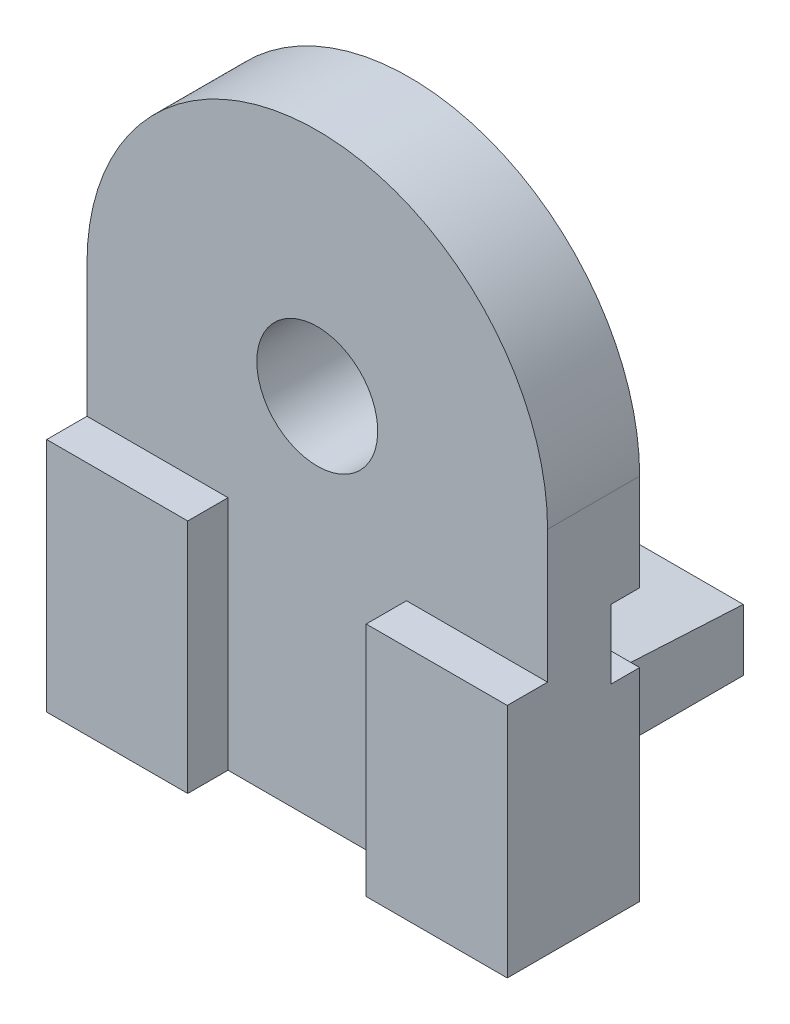
ISO-10303-21;
HEADER;
FILE_DESCRIPTION(('STEP AP214'),'2;1');
FILE_NAME('part.step','',(''),(''),'','','');
FILE_SCHEMA(('AUTOMOTIVE_DESIGN { 1 0 10303 214 1 1 1 1 }'));
ENDSEC;
DATA;
#1=APPLICATION_CONTEXT('core data for automotive mechanical design processes');
#2=APPLICATION_PROTOCOL_DEFINITION('international standard','automotive_design',2000,#1);
#3=PRODUCT_CONTEXT('',#1,'mechanical');
#4=PRODUCT('Part','Part','',(#3));
#5=PRODUCT_RELATED_PRODUCT_CATEGORY('part','',(#4));
#6=PRODUCT_DEFINITION_FORMATION('','',#4);
#7=PRODUCT_DEFINITION_CONTEXT('part definition',#1,'design');
#8=PRODUCT_DEFINITION('design','',#6,#7);
#9=PRODUCT_DEFINITION_SHAPE('','',#8);
#10=(LENGTH_UNIT() NAMED_UNIT(*) SI_UNIT(.MILLI.,.METRE.));
#11=(NAMED_UNIT(*) PLANE_ANGLE_UNIT() SI_UNIT($,.RADIAN.));
#12=(NAMED_UNIT(*) SI_UNIT($,.STERADIAN.) SOLID_ANGLE_UNIT());
#13=UNCERTAINTY_MEASURE_WITH_UNIT(LENGTH_MEASURE(1.E-05),#10,'distance_accuracy_value','');
#14=(GEOMETRIC_REPRESENTATION_CONTEXT(3) GLOBAL_UNCERTAINTY_ASSIGNED_CONTEXT((#13)) GLOBAL_UNIT_ASSIGNED_CONTEXT((#10,
#11,#12)) REPRESENTATION_CONTEXT('',''));
#15=CARTESIAN_POINT('',(0.,0.,0.));
#16=DIRECTION('',(0.,0.,1.));
#17=DIRECTION('',(1.,0.,0.));
#18=AXIS2_PLACEMENT_3D('',#15,#16,#17);
#19=CARTESIAN_POINT('',(-1.55,4.1,2.3));
#20=DIRECTION('',(-1.,0.,0.));
#21=DIRECTION('',(0.,-1.,0.));
#22=AXIS2_PLACEMENT_3D('',#19,#20,#21);
#23=PLANE('',#22);
#24=DIRECTION('',(0.,1.,0.));
#25=VECTOR('',#24,1.);
#26=CARTESIAN_POINT('',(-1.55,0.,2.3));
#27=LINE('',#26,#25);
#28=CARTESIAN_POINT('',(-1.55,0.,2.3));
#29=VERTEX_POINT('',#28);
#30=CARTESIAN_POINT('',(-1.55,4.1,2.3));
#31=VERTEX_POINT('',#30);
#32=EDGE_CURVE('E135',#29,#31,#27,.T.);
#33=ORIENTED_EDGE('',*,*,#32,.F.);
#34=DIRECTION('',(0.,0.,1.));
#35=VECTOR('',#34,1.);
#36=CARTESIAN_POINT('',(-1.55,0.,2.3));
#37=LINE('',#36,#35);
#38=CARTESIAN_POINT('',(-1.55,0.,1.6));
#39=VERTEX_POINT('',#38);
#40=EDGE_CURVE('E106',#39,#29,#37,.T.);
#41=ORIENTED_EDGE('',*,*,#40,.F.);
#42=DIRECTION('',(0.,1.,0.));
#43=VECTOR('',#42,1.);
#44=CARTESIAN_POINT('',(-1.55,6.4,1.6));
#45=LINE('',#44,#43);
#46=CARTESIAN_POINT('',(-1.55,4.1,1.6));
#47=VERTEX_POINT('',#46);
#48=EDGE_CURVE('E147',#47,#39,#45,.F.);
#49=ORIENTED_EDGE('',*,*,#48,.F.);
#50=DIRECTION('',(0.,0.,1.));
#51=VECTOR('',#50,1.);
#52=CARTESIAN_POINT('',(-1.55,4.1,2.3));
#53=LINE('',#52,#51);
#54=EDGE_CURVE('E145',#47,#31,#53,.T.);
#55=ORIENTED_EDGE('',*,*,#54,.T.);
#56=EDGE_LOOP('',(#33,#41,#49,#55));
#57=FACE_BOUND('',#56,.T.);
#58=ADVANCED_FACE('F17',(#57),#23,.F.);
#59=CARTESIAN_POINT('',(1.55,4.1,2.3));
#60=DIRECTION('',(1.,0.,0.));
#61=DIRECTION('',(0.,1.,0.));
#62=AXIS2_PLACEMENT_3D('',#59,#60,#61);
#63=PLANE('',#62);
#64=DIRECTION('',(0.,1.,0.));
#65=VECTOR('',#64,1.);
#66=CARTESIAN_POINT('',(1.55,4.1,2.3));
#67=LINE('',#66,#65);
#68=CARTESIAN_POINT('',(1.55,4.1,2.3));
#69=VERTEX_POINT('',#68);
#70=CARTESIAN_POINT('',(1.55,0.,2.3));
#71=VERTEX_POINT('',#70);
#72=EDGE_CURVE('E180',#69,#71,#67,.F.);
#73=ORIENTED_EDGE('',*,*,#72,.F.);
#74=DIRECTION('',(0.,0.,1.));
#75=VECTOR('',#74,1.);
#76=CARTESIAN_POINT('',(1.55,4.1,2.3));
#77=LINE('',#76,#75);
#78=CARTESIAN_POINT('',(1.55,4.1,1.6));
#79=VERTEX_POINT('',#78);
#80=EDGE_CURVE('E151',#69,#79,#77,.F.);
#81=ORIENTED_EDGE('',*,*,#80,.T.);
#82=DIRECTION('',(0.,1.,0.));
#83=VECTOR('',#82,1.);
#84=CARTESIAN_POINT('',(1.55,6.4,1.6));
#85=LINE('',#84,#83);
#86=CARTESIAN_POINT('',(1.55,0.,1.6));
#87=VERTEX_POINT('',#86);
#88=EDGE_CURVE('E76',#87,#79,#85,.T.);
#89=ORIENTED_EDGE('',*,*,#88,.F.);
#90=DIRECTION('',(0.,0.,1.));
#91=VECTOR('',#90,1.);
#92=CARTESIAN_POINT('',(1.55,0.,2.3));
#93=LINE('',#92,#91);
#94=EDGE_CURVE('E185',#71,#87,#93,.F.);
#95=ORIENTED_EDGE('',*,*,#94,.F.);
#96=EDGE_LOOP('',(#73,#81,#89,#95));
#97=FACE_BOUND('',#96,.T.);
#98=ADVANCED_FACE('F404',(#97),#63,.F.);
#99=CARTESIAN_POINT('',(4.,4.1,2.3));
#100=DIRECTION('',(0.,-1.,0.));
#101=DIRECTION('',(1.,0.,0.));
#102=AXIS2_PLACEMENT_3D('',#99,#100,#101);
#103=PLANE('',#102);
#104=DIRECTION('',(1.,0.,0.));
#105=VECTOR('',#104,1.);
#106=CARTESIAN_POINT('',(1.55,4.1,2.3));
#107=LINE('',#106,#105);
#108=CARTESIAN_POINT('',(4.,4.1,2.3));
#109=VERTEX_POINT('',#108);
#110=EDGE_CURVE('E205',#109,#69,#107,.F.);
#111=ORIENTED_EDGE('',*,*,#110,.F.);
#112=DIRECTION('',(0.,0.,1.));
#113=VECTOR('',#112,1.);
#114=CARTESIAN_POINT('',(4.,4.1,2.3));
#115=LINE('',#114,#113);
#116=CARTESIAN_POINT('',(4.,4.1,1.6));
#117=VERTEX_POINT('',#116);
#118=EDGE_CURVE('E183',#117,#109,#115,.T.);
#119=ORIENTED_EDGE('',*,*,#118,.F.);
#120=DIRECTION('',(1.,0.,0.));
#121=VECTOR('',#120,1.);
#122=CARTESIAN_POINT('',(0.,4.1,1.6));
#123=LINE('',#122,#121);
#124=EDGE_CURVE('E171',#79,#117,#123,.T.);
#125=ORIENTED_EDGE('',*,*,#124,.F.);
#126=ORIENTED_EDGE('',*,*,#80,.F.);
#127=EDGE_LOOP('',(#111,#119,#125,#126));
#128=FACE_BOUND('',#127,.T.);
#129=ADVANCED_FACE('F403',(#128),#103,.F.);
#130=CARTESIAN_POINT('',(-4.,4.1,2.3));
#131=DIRECTION('',(0.,-1.,0.));
#132=DIRECTION('',(1.,0.,0.));
#133=AXIS2_PLACEMENT_3D('',#130,#131,#132);
#134=PLANE('',#133);
#135=DIRECTION('',(1.,0.,0.));
#136=VECTOR('',#135,1.);
#137=CARTESIAN_POINT('',(-4.,4.1,2.3));
#138=LINE('',#137,#136);
#139=CARTESIAN_POINT('',(-4.,4.1,2.3));
#140=VERTEX_POINT('',#139);
#141=EDGE_CURVE('E139',#31,#140,#138,.F.);
#142=ORIENTED_EDGE('',*,*,#141,.F.);
#143=ORIENTED_EDGE('',*,*,#54,.F.);
#144=DIRECTION('',(1.,0.,0.));
#145=VECTOR('',#144,1.);
#146=CARTESIAN_POINT('',(0.,4.1,1.6));
#147=LINE('',#146,#145);
#148=CARTESIAN_POINT('',(-4.,4.1,1.6));
#149=VERTEX_POINT('',#148);
#150=EDGE_CURVE('E169',#149,#47,#147,.T.);
#151=ORIENTED_EDGE('',*,*,#150,.F.);
#152=DIRECTION('',(0.,0.,1.));
#153=VECTOR('',#152,1.);
#154=CARTESIAN_POINT('',(-4.,4.1,2.3));
#155=LINE('',#154,#153);
#156=EDGE_CURVE('E142',#140,#149,#155,.F.);
#157=ORIENTED_EDGE('',*,*,#156,.F.);
#158=EDGE_LOOP('',(#142,#143,#151,#157));
#159=FACE_BOUND('',#158,.T.);
#160=ADVANCED_FACE('F153',(#159),#134,.F.);
#161=CARTESIAN_POINT('',(-4.,0.,2.3));
#162=DIRECTION('',(0.,0.,1.));
#163=DIRECTION('',(1.,0.,0.));
#164=AXIS2_PLACEMENT_3D('',#161,#162,#163);
#165=PLANE('',#164);
#166=DIRECTION('',(0.,1.,0.));
#167=VECTOR('',#166,1.);
#168=CARTESIAN_POINT('',(-4.,6.4,2.3));
#169=LINE('',#168,#167);
#170=CARTESIAN_POINT('',(-4.,0.,2.3));
#171=VERTEX_POINT('',#170);
#172=EDGE_CURVE('E115',#140,#171,#169,.F.);
#173=ORIENTED_EDGE('',*,*,#172,.T.);
#174=DIRECTION('',(-1.,0.,0.));
#175=VECTOR('',#174,1.);
#176=CARTESIAN_POINT('',(-4.,0.,2.3));
#177=LINE('',#176,#175);
#178=EDGE_CURVE('E140',#171,#29,#177,.F.);
#179=ORIENTED_EDGE('',*,*,#178,.T.);
#180=ORIENTED_EDGE('',*,*,#32,.T.);
#181=ORIENTED_EDGE('',*,*,#141,.T.);
#182=EDGE_LOOP('',(#173,#179,#180,#181));
#183=FACE_BOUND('',#182,.T.);
#184=ADVANCED_FACE('F137',(#183),#165,.T.);
#185=CARTESIAN_POINT('',(1.5,1.07,0.));
#186=DIRECTION('',(1.,0.,0.));
#187=DIRECTION('',(0.,1.,0.));
#188=AXIS2_PLACEMENT_3D('',#185,#186,#187);
#189=PLANE('',#188);
#190=DIRECTION('',(0.,0.,1.));
#191=VECTOR('',#190,1.);
#192=CARTESIAN_POINT('',(1.5,0.,1.6));
#193=LINE('',#192,#191);
#194=CARTESIAN_POINT('',(1.5,0.,0.));
#195=VERTEX_POINT('',#194);
#196=CARTESIAN_POINT('',(1.5,0.,-4.3));
#197=VERTEX_POINT('',#196);
#198=EDGE_CURVE('E287',#195,#197,#193,.F.);
#199=ORIENTED_EDGE('',*,*,#198,.T.);
#200=DIRECTION('',(0.,1.,0.));
#201=VECTOR('',#200,1.);
#202=CARTESIAN_POINT('',(1.5,1.07,-4.3));
#203=LINE('',#202,#201);
#204=CARTESIAN_POINT('',(1.5,1.07,-4.3));
#205=VERTEX_POINT('',#204);
#206=EDGE_CURVE('E156',#205,#197,#203,.F.);
#207=ORIENTED_EDGE('',*,*,#206,.F.);
#208=DIRECTION('',(0.,0.0534120206101486,0.9985725592336));
#209=VECTOR('',#208,1.);
#210=CARTESIAN_POINT('',(1.5,1.3,0.));
#211=LINE('',#210,#209);
#212=CARTESIAN_POINT('',(1.5,1.3,0.));
#213=VERTEX_POINT('',#212);
#214=EDGE_CURVE('E211',#213,#205,#211,.F.);
#215=ORIENTED_EDGE('',*,*,#214,.F.);
#216=DIRECTION('',(0.,1.,0.));
#217=VECTOR('',#216,1.);
#218=CARTESIAN_POINT('',(1.5,1.07,0.));
#219=LINE('',#218,#217);
#220=EDGE_CURVE('E154',#213,#195,#219,.F.);
#221=ORIENTED_EDGE('',*,*,#220,.T.);
#222=EDGE_LOOP('',(#199,#207,#215,#221));
#223=FACE_BOUND('',#222,.T.);
#224=ADVANCED_FACE('F424',(#223),#189,.T.);
#225=CARTESIAN_POINT('',(-1.5,1.07,-4.3));
#226=DIRECTION('',(0.,0.,-1.));
#227=DIRECTION('',(-1.,0.,0.));
#228=AXIS2_PLACEMENT_3D('',#225,#226,#227);
#229=PLANE('',#228);
#230=DIRECTION('',(-1.,0.,0.));
#231=VECTOR('',#230,1.);
#232=CARTESIAN_POINT('',(-4.,0.,-4.3));
#233=LINE('',#232,#231);
#234=CARTESIAN_POINT('',(-1.5,0.,-4.3));
#235=VERTEX_POINT('',#234);
#236=EDGE_CURVE('E286',#197,#235,#233,.T.);
#237=ORIENTED_EDGE('',*,*,#236,.T.);
#238=DIRECTION('',(0.,-1.,0.));
#239=VECTOR('',#238,1.);
#240=CARTESIAN_POINT('',(-1.5,1.07,-4.3));
#241=LINE('',#240,#239);
#242=CARTESIAN_POINT('',(-1.5,1.07000000000002,-4.3));
#243=VERTEX_POINT('',#242);
#244=EDGE_CURVE('E331',#243,#235,#241,.T.);
#245=ORIENTED_EDGE('',*,*,#244,.F.);
#246=DIRECTION('',(1.,0.,0.));
#247=VECTOR('',#246,1.);
#248=CARTESIAN_POINT('',(0.,1.07000000000009,-4.30000000000001));
#249=LINE('',#248,#247);
#250=EDGE_CURVE('E213',#205,#243,#249,.F.);
#251=ORIENTED_EDGE('',*,*,#250,.F.);
#252=ORIENTED_EDGE('',*,*,#206,.T.);
#253=EDGE_LOOP('',(#237,#245,#251,#252));
#254=FACE_BOUND('',#253,.T.);
#255=ADVANCED_FACE('F419',(#254),#229,.T.);
#256=CARTESIAN_POINT('',(-1.5,1.07,0.));
#257=DIRECTION('',(-1.,0.,0.));
#258=DIRECTION('',(0.,-1.,0.));
#259=AXIS2_PLACEMENT_3D('',#256,#257,#258);
#260=PLANE('',#259);
#261=DIRECTION('',(0.,0.,1.));
#262=VECTOR('',#261,1.);
#263=CARTESIAN_POINT('',(-1.5,0.,1.6));
#264=LINE('',#263,#262);
#265=CARTESIAN_POINT('',(-1.5,0.,0.));
#266=VERTEX_POINT('',#265);
#267=EDGE_CURVE('E283',#235,#266,#264,.T.);
#268=ORIENTED_EDGE('',*,*,#267,.T.);
#269=DIRECTION('',(0.,-1.,0.));
#270=VECTOR('',#269,1.);
#271=CARTESIAN_POINT('',(-1.5,1.07,0.));
#272=LINE('',#271,#270);
#273=CARTESIAN_POINT('',(-1.5,1.3,0.));
#274=VERTEX_POINT('',#273);
#275=EDGE_CURVE('E208',#266,#274,#272,.F.);
#276=ORIENTED_EDGE('',*,*,#275,.T.);
#277=DIRECTION('',(0.,0.0534120206101486,0.9985725592336));
#278=VECTOR('',#277,1.);
#279=CARTESIAN_POINT('',(-1.5,1.3,0.));
#280=LINE('',#279,#278);
#281=EDGE_CURVE('E214',#243,#274,#280,.T.);
#282=ORIENTED_EDGE('',*,*,#281,.F.);
#283=ORIENTED_EDGE('',*,*,#244,.T.);
#284=EDGE_LOOP('',(#268,#276,#282,#283));
#285=FACE_BOUND('',#284,.T.);
#286=ADVANCED_FACE('F415',(#285),#260,.T.);
#287=CARTESIAN_POINT('',(1.55,4.1,2.3));
#288=DIRECTION('',(0.,0.,1.));
#289=DIRECTION('',(1.,0.,0.));
#290=AXIS2_PLACEMENT_3D('',#287,#288,#289);
#291=PLANE('',#290);
#292=ORIENTED_EDGE('',*,*,#110,.T.);
#293=ORIENTED_EDGE('',*,*,#72,.T.);
#294=DIRECTION('',(-1.,0.,0.));
#295=VECTOR('',#294,1.);
#296=CARTESIAN_POINT('',(-4.,0.,2.3));
#297=LINE('',#296,#295);
#298=CARTESIAN_POINT('',(4.,0.,2.3));
#299=VERTEX_POINT('',#298);
#300=EDGE_CURVE('E199',#71,#299,#297,.F.);
#301=ORIENTED_EDGE('',*,*,#300,.T.);
#302=DIRECTION('',(0.,-1.,0.));
#303=VECTOR('',#302,1.);
#304=CARTESIAN_POINT('',(4.,6.4,2.3));
#305=LINE('',#304,#303);
#306=EDGE_CURVE('E275',#299,#109,#305,.F.);
#307=ORIENTED_EDGE('',*,*,#306,.T.);
#308=EDGE_LOOP('',(#292,#293,#301,#307));
#309=FACE_BOUND('',#308,.T.);
#310=ADVANCED_FACE('F352',(#309),#291,.T.);
#311=CARTESIAN_POINT('',(1.1,4.12,0.5));
#312=DIRECTION('',(0.,0.,-1.));
#313=DIRECTION('',(-1.,0.,0.));
#314=AXIS2_PLACEMENT_3D('',#311,#312,#313);
#315=PLANE('',#314);
#316=DIRECTION('',(0.,-1.,0.));
#317=VECTOR('',#316,1.);
#318=CARTESIAN_POINT('',(4.,6.4,0.5));
#319=LINE('',#318,#317);
#320=CARTESIAN_POINT('',(4.,4.72,0.5));
#321=VERTEX_POINT('',#320);
#322=CARTESIAN_POINT('',(4.,3.52,0.5));
#323=VERTEX_POINT('',#322);
#324=EDGE_CURVE('E276',#321,#323,#319,.T.);
#325=ORIENTED_EDGE('',*,*,#324,.T.);
#326=DIRECTION('',(1.,0.,0.));
#327=VECTOR('',#326,1.);
#328=CARTESIAN_POINT('',(4.,3.52,0.5));
#329=LINE('',#328,#327);
#330=CARTESIAN_POINT('',(1.1,3.52,0.5));
#331=VERTEX_POINT('',#330);
#332=EDGE_CURVE('E251',#323,#331,#329,.F.);
#333=ORIENTED_EDGE('',*,*,#332,.T.);
#334=CARTESIAN_POINT('',(1.1,4.12,0.5));
#335=DIRECTION('',(0.,0.,-1.));
#336=DIRECTION('',(-1.,0.,0.));
#337=AXIS2_PLACEMENT_3D('',#334,#335,#336);
#338=CIRCLE('',#337,0.6);
#339=CARTESIAN_POINT('',(1.1,4.72,0.5));
#340=VERTEX_POINT('',#339);
#341=EDGE_CURVE('E241',#331,#340,#338,.T.);
#342=ORIENTED_EDGE('',*,*,#341,.T.);
#343=DIRECTION('',(-1.,0.,0.));
#344=VECTOR('',#343,1.);
#345=CARTESIAN_POINT('',(4.,4.72,0.5));
#346=LINE('',#345,#344);
#347=EDGE_CURVE('E248',#340,#321,#346,.F.);
#348=ORIENTED_EDGE('',*,*,#347,.T.);
#349=EDGE_LOOP('',(#325,#333,#342,#348));
#350=FACE_BOUND('',#349,.T.);
#351=ADVANCED_FACE('F431',(#350),#315,.T.);
#352=CARTESIAN_POINT('',(0.,6.4,1.6));
#353=DIRECTION('',(0.,0.,1.));
#354=DIRECTION('',(1.,0.,0.));
#355=AXIS2_PLACEMENT_3D('',#352,#353,#354);
#356=PLANE('',#355);
#357=CARTESIAN_POINT('',(0.,6.4,1.6));
#358=DIRECTION('',(0.,0.,-1.));
#359=DIRECTION('',(-1.,0.,0.));
#360=AXIS2_PLACEMENT_3D('',#357,#358,#359);
#361=CIRCLE('',#360,1.05);
#362=CARTESIAN_POINT('',(-1.04999999999999,6.4,1.6));
#363=VERTEX_POINT('',#362);
#364=EDGE_CURVE('E238',#363,#363,#361,.T.);
#365=ORIENTED_EDGE('',*,*,#364,.T.);
#366=EDGE_LOOP('',(#365));
#367=FACE_BOUND('',#366,.T.);
#368=DIRECTION('',(0.,1.,0.));
#369=VECTOR('',#368,1.);
#370=CARTESIAN_POINT('',(-4.,6.4,1.6));
#371=LINE('',#370,#369);
#372=CARTESIAN_POINT('',(-4.,6.4,1.6));
#373=VERTEX_POINT('',#372);
#374=EDGE_CURVE('E164',#373,#149,#371,.F.);
#375=ORIENTED_EDGE('',*,*,#374,.T.);
#376=ORIENTED_EDGE('',*,*,#150,.T.);
#377=ORIENTED_EDGE('',*,*,#48,.T.);
#378=DIRECTION('',(-1.,0.,0.));
#379=VECTOR('',#378,1.);
#380=CARTESIAN_POINT('',(-4.,0.,1.6));
#381=LINE('',#380,#379);
#382=EDGE_CURVE('E197',#39,#87,#381,.F.);
#383=ORIENTED_EDGE('',*,*,#382,.T.);
#384=ORIENTED_EDGE('',*,*,#88,.T.);
#385=ORIENTED_EDGE('',*,*,#124,.T.);
#386=DIRECTION('',(0.,-1.,0.));
#387=VECTOR('',#386,1.);
#388=CARTESIAN_POINT('',(4.,6.4,1.6));
#389=LINE('',#388,#387);
#390=CARTESIAN_POINT('',(4.,6.4,1.6));
#391=VERTEX_POINT('',#390);
#392=EDGE_CURVE('E305',#117,#391,#389,.F.);
#393=ORIENTED_EDGE('',*,*,#392,.T.);
#394=CARTESIAN_POINT('',(0.,6.4,1.6));
#395=DIRECTION('',(0.,0.,-1.));
#396=DIRECTION('',(-1.,0.,0.));
#397=AXIS2_PLACEMENT_3D('',#394,#395,#396);
#398=CIRCLE('',#397,4.);
#399=EDGE_CURVE('E20',#373,#391,#398,.T.);
#400=ORIENTED_EDGE('',*,*,#399,.F.);
#401=EDGE_LOOP('',(#375,#376,#377,#383,#384,#385,#393,#400));
#402=FACE_BOUND('',#401,.T.);
#403=ADVANCED_FACE('F400',(#367,#402),#356,.T.);
#404=CARTESIAN_POINT('',(0.,6.4,1.6));
#405=DIRECTION('',(0.,0.,-1.));
#406=DIRECTION('',(-1.,0.,0.));
#407=AXIS2_PLACEMENT_3D('',#404,#405,#406);
#408=CYLINDRICAL_SURFACE('',#407,4.);
#409=CARTESIAN_POINT('',(0.,6.4,0.));
#410=DIRECTION('',(0.,0.,-1.));
#411=DIRECTION('',(-1.,0.,0.));
#412=AXIS2_PLACEMENT_3D('',#409,#410,#411);
#413=CIRCLE('',#412,4.);
#414=CARTESIAN_POINT('',(4.,6.4,0.));
#415=VERTEX_POINT('',#414);
#416=CARTESIAN_POINT('',(-4.,6.4,0.));
#417=VERTEX_POINT('',#416);
#418=EDGE_CURVE('E233',#415,#417,#413,.F.);
#419=ORIENTED_EDGE('',*,*,#418,.T.);
#420=DIRECTION('',(0.,0.,1.));
#421=VECTOR('',#420,1.);
#422=CARTESIAN_POINT('',(-4.,6.4,1.6));
#423=LINE('',#422,#421);
#424=EDGE_CURVE('E166',#417,#373,#423,.T.);
#425=ORIENTED_EDGE('',*,*,#424,.T.);
#426=ORIENTED_EDGE('',*,*,#399,.T.);
#427=DIRECTION('',(0.,0.,1.));
#428=VECTOR('',#427,1.);
#429=CARTESIAN_POINT('',(4.,6.4,1.6));
#430=LINE('',#429,#428);
#431=EDGE_CURVE('E264',#391,#415,#430,.F.);
#432=ORIENTED_EDGE('',*,*,#431,.T.);
#433=EDGE_LOOP('',(#419,#425,#426,#432));
#434=FACE_BOUND('',#433,.T.);
#435=ADVANCED_FACE('F398',(#434),#408,.T.);
#436=CARTESIAN_POINT('',(-4.,6.4,1.6));
#437=DIRECTION('',(1.,0.,0.));
#438=DIRECTION('',(0.,1.,0.));
#439=AXIS2_PLACEMENT_3D('',#436,#437,#438);
#440=PLANE('',#439);
#441=ORIENTED_EDGE('',*,*,#172,.F.);
#442=ORIENTED_EDGE('',*,*,#156,.T.);
#443=ORIENTED_EDGE('',*,*,#374,.F.);
#444=ORIENTED_EDGE('',*,*,#424,.F.);
#445=DIRECTION('',(0.,1.,0.));
#446=VECTOR('',#445,1.);
#447=CARTESIAN_POINT('',(-4.,6.4,0.));
#448=LINE('',#447,#446);
#449=CARTESIAN_POINT('',(-4.,0.,0.));
#450=VERTEX_POINT('',#449);
#451=EDGE_CURVE('E236',#417,#450,#448,.F.);
#452=ORIENTED_EDGE('',*,*,#451,.T.);
#453=DIRECTION('',(0.,0.,1.));
#454=VECTOR('',#453,1.);
#455=CARTESIAN_POINT('',(-4.,0.,1.6));
#456=LINE('',#455,#454);
#457=EDGE_CURVE('E219',#450,#171,#456,.T.);
#458=ORIENTED_EDGE('',*,*,#457,.T.);
#459=EDGE_LOOP('',(#441,#442,#443,#444,#452,#458));
#460=FACE_BOUND('',#459,.T.);
#461=ADVANCED_FACE('F406',(#460),#440,.F.);
#462=CARTESIAN_POINT('',(0.,1.3,0.));
#463=DIRECTION('',(0.,0.9985725592336,-0.0534120206101486));
#464=DIRECTION('',(0.,0.0534120206101486,0.9985725592336));
#465=AXIS2_PLACEMENT_3D('',#462,#463,#464);
#466=PLANE('',#465);
#467=ORIENTED_EDGE('',*,*,#214,.T.);
#468=ORIENTED_EDGE('',*,*,#250,.T.);
#469=ORIENTED_EDGE('',*,*,#281,.T.);
#470=DIRECTION('',(1.,0.,0.));
#471=VECTOR('',#470,1.);
#472=CARTESIAN_POINT('',(0.,1.3,0.));
#473=LINE('',#472,#471);
#474=EDGE_CURVE('E222',#274,#213,#473,.T.);
#475=ORIENTED_EDGE('',*,*,#474,.T.);
#476=EDGE_LOOP('',(#467,#468,#469,#475));
#477=FACE_BOUND('',#476,.T.);
#478=ADVANCED_FACE('F426',(#477),#466,.T.);
#479=CARTESIAN_POINT('',(-4.,0.,1.6));
#480=DIRECTION('',(0.,1.,0.));
#481=DIRECTION('',(-1.,0.,0.));
#482=AXIS2_PLACEMENT_3D('',#479,#480,#481);
#483=PLANE('',#482);
#484=ORIENTED_EDGE('',*,*,#236,.F.);
#485=ORIENTED_EDGE('',*,*,#198,.F.);
#486=DIRECTION('',(1.,0.,0.));
#487=VECTOR('',#486,1.);
#488=CARTESIAN_POINT('',(0.,0.,0.));
#489=LINE('',#488,#487);
#490=CARTESIAN_POINT('',(4.,0.,0.));
#491=VERTEX_POINT('',#490);
#492=EDGE_CURVE('E225',#195,#491,#489,.T.);
#493=ORIENTED_EDGE('',*,*,#492,.T.);
#494=DIRECTION('',(0.,0.,1.));
#495=VECTOR('',#494,1.);
#496=CARTESIAN_POINT('',(4.,0.,1.6));
#497=LINE('',#496,#495);
#498=EDGE_CURVE('E272',#491,#299,#497,.T.);
#499=ORIENTED_EDGE('',*,*,#498,.T.);
#500=ORIENTED_EDGE('',*,*,#300,.F.);
#501=ORIENTED_EDGE('',*,*,#94,.T.);
#502=ORIENTED_EDGE('',*,*,#382,.F.);
#503=ORIENTED_EDGE('',*,*,#40,.T.);
#504=ORIENTED_EDGE('',*,*,#178,.F.);
#505=ORIENTED_EDGE('',*,*,#457,.F.);
#506=DIRECTION('',(1.,0.,0.));
#507=VECTOR('',#506,1.);
#508=CARTESIAN_POINT('',(0.,0.,0.));
#509=LINE('',#508,#507);
#510=EDGE_CURVE('E226',#450,#266,#509,.T.);
#511=ORIENTED_EDGE('',*,*,#510,.T.);
#512=ORIENTED_EDGE('',*,*,#267,.F.);
#513=EDGE_LOOP('',(#484,#485,#493,#499,#500,#501,#502,#503,#504,#505,#511,#512));
#514=FACE_BOUND('',#513,.T.);
#515=ADVANCED_FACE('F357',(#514),#483,.F.);
#516=CARTESIAN_POINT('',(4.,6.4,1.6));
#517=DIRECTION('',(-1.,0.,0.));
#518=DIRECTION('',(0.,-1.,0.));
#519=AXIS2_PLACEMENT_3D('',#516,#517,#518);
#520=PLANE('',#519);
#521=DIRECTION('',(0.,1.,0.));
#522=VECTOR('',#521,1.);
#523=CARTESIAN_POINT('',(4.,6.4,0.));
#524=LINE('',#523,#522);
#525=CARTESIAN_POINT('',(4.,4.72,0.));
#526=VERTEX_POINT('',#525);
#527=EDGE_CURVE('E237',#526,#415,#524,.T.);
#528=ORIENTED_EDGE('',*,*,#527,.T.);
#529=ORIENTED_EDGE('',*,*,#431,.F.);
#530=ORIENTED_EDGE('',*,*,#392,.F.);
#531=ORIENTED_EDGE('',*,*,#118,.T.);
#532=ORIENTED_EDGE('',*,*,#306,.F.);
#533=ORIENTED_EDGE('',*,*,#498,.F.);
#534=DIRECTION('',(0.,1.,0.));
#535=VECTOR('',#534,1.);
#536=CARTESIAN_POINT('',(4.,6.4,0.));
#537=LINE('',#536,#535);
#538=CARTESIAN_POINT('',(4.,3.52,0.));
#539=VERTEX_POINT('',#538);
#540=EDGE_CURVE('E267',#491,#539,#537,.T.);
#541=ORIENTED_EDGE('',*,*,#540,.T.);
#542=DIRECTION('',(0.,0.,1.));
#543=VECTOR('',#542,1.);
#544=CARTESIAN_POINT('',(4.,3.52,0.5));
#545=LINE('',#544,#543);
#546=EDGE_CURVE('E256',#539,#323,#545,.T.);
#547=ORIENTED_EDGE('',*,*,#546,.T.);
#548=ORIENTED_EDGE('',*,*,#324,.F.);
#549=DIRECTION('',(0.,0.,1.));
#550=VECTOR('',#549,1.);
#551=CARTESIAN_POINT('',(4.,4.72,0.5));
#552=LINE('',#551,#550);
#553=EDGE_CURVE('E240',#321,#526,#552,.F.);
#554=ORIENTED_EDGE('',*,*,#553,.T.);
#555=EDGE_LOOP('',(#528,#529,#530,#531,#532,#533,#541,#547,#548,#554));
#556=FACE_BOUND('',#555,.T.);
#557=ADVANCED_FACE('F364',(#556),#520,.F.);
#558=CARTESIAN_POINT('',(4.,3.52,0.5));
#559=DIRECTION('',(0.,-1.,0.));
#560=DIRECTION('',(1.,0.,0.));
#561=AXIS2_PLACEMENT_3D('',#558,#559,#560);
#562=PLANE('',#561);
#563=ORIENTED_EDGE('',*,*,#332,.F.);
#564=ORIENTED_EDGE('',*,*,#546,.F.);
#565=DIRECTION('',(1.,0.,0.));
#566=VECTOR('',#565,1.);
#567=CARTESIAN_POINT('',(0.,3.52,0.));
#568=LINE('',#567,#566);
#569=CARTESIAN_POINT('',(1.1,3.52,0.));
#570=VERTEX_POINT('',#569);
#571=EDGE_CURVE('E232',#539,#570,#568,.F.);
#572=ORIENTED_EDGE('',*,*,#571,.T.);
#573=DIRECTION('',(0.,0.,-1.));
#574=VECTOR('',#573,1.);
#575=CARTESIAN_POINT('',(1.1,3.52,0.5));
#576=LINE('',#575,#574);
#577=EDGE_CURVE('E243',#570,#331,#576,.F.);
#578=ORIENTED_EDGE('',*,*,#577,.T.);
#579=EDGE_LOOP('',(#563,#564,#572,#578));
#580=FACE_BOUND('',#579,.T.);
#581=ADVANCED_FACE('F432',(#580),#562,.F.);
#582=CARTESIAN_POINT('',(1.1,4.12,0.5));
#583=DIRECTION('',(0.,0.,-1.));
#584=DIRECTION('',(-1.,0.,0.));
#585=AXIS2_PLACEMENT_3D('',#582,#583,#584);
#586=CYLINDRICAL_SURFACE('',#585,0.6);
#587=ORIENTED_EDGE('',*,*,#341,.F.);
#588=ORIENTED_EDGE('',*,*,#577,.F.);
#589=CARTESIAN_POINT('',(1.1,4.12,0.));
#590=DIRECTION('',(0.,0.,-1.));
#591=DIRECTION('',(-1.,0.,0.));
#592=AXIS2_PLACEMENT_3D('',#589,#590,#591);
#593=CIRCLE('',#592,0.6);
#594=CARTESIAN_POINT('',(1.1,4.72,0.));
#595=VERTEX_POINT('',#594);
#596=EDGE_CURVE('E35',#570,#595,#593,.T.);
#597=ORIENTED_EDGE('',*,*,#596,.T.);
#598=DIRECTION('',(0.,0.,1.));
#599=VECTOR('',#598,1.);
#600=CARTESIAN_POINT('',(1.1,4.72,0.5));
#601=LINE('',#600,#599);
#602=EDGE_CURVE('E242',#595,#340,#601,.T.);
#603=ORIENTED_EDGE('',*,*,#602,.T.);
#604=EDGE_LOOP('',(#587,#588,#597,#603));
#605=FACE_BOUND('',#604,.T.);
#606=ADVANCED_FACE('F434',(#605),#586,.F.);
#607=CARTESIAN_POINT('',(4.,4.72,0.5));
#608=DIRECTION('',(0.,1.,0.));
#609=DIRECTION('',(-1.,0.,0.));
#610=AXIS2_PLACEMENT_3D('',#607,#608,#609);
#611=PLANE('',#610);
#612=ORIENTED_EDGE('',*,*,#347,.F.);
#613=ORIENTED_EDGE('',*,*,#602,.F.);
#614=DIRECTION('',(1.,0.,0.));
#615=VECTOR('',#614,1.);
#616=CARTESIAN_POINT('',(0.,4.72,0.));
#617=LINE('',#616,#615);
#618=EDGE_CURVE('E26',#595,#526,#617,.T.);
#619=ORIENTED_EDGE('',*,*,#618,.T.);
#620=ORIENTED_EDGE('',*,*,#553,.F.);
#621=EDGE_LOOP('',(#612,#613,#619,#620));
#622=FACE_BOUND('',#621,.T.);
#623=ADVANCED_FACE('F393',(#622),#611,.F.);
#624=CARTESIAN_POINT('',(0.,6.4,2.300025));
#625=DIRECTION('',(0.,0.,-1.));
#626=DIRECTION('',(-1.,0.,0.));
#627=AXIS2_PLACEMENT_3D('',#624,#625,#626);
#628=CYLINDRICAL_SURFACE('',#627,1.05);
#629=ORIENTED_EDGE('',*,*,#364,.F.);
#630=EDGE_LOOP('',(#629));
#631=FACE_BOUND('',#630,.T.);
#632=CARTESIAN_POINT('',(0.,6.4,0.));
#633=DIRECTION('',(0.,0.,-1.));
#634=DIRECTION('',(-1.,0.,0.));
#635=AXIS2_PLACEMENT_3D('',#632,#633,#634);
#636=CIRCLE('',#635,1.05);
#637=CARTESIAN_POINT('',(-1.04999999999999,6.4,0.));
#638=VERTEX_POINT('',#637);
#639=EDGE_CURVE('E11',#638,#638,#636,.T.);
#640=ORIENTED_EDGE('',*,*,#639,.T.);
#641=EDGE_LOOP('',(#640));
#642=FACE_BOUND('',#641,.T.);
#643=ADVANCED_FACE('F444',(#631,#642),#628,.F.);
#644=CARTESIAN_POINT('',(0.,6.4,0.));
#645=DIRECTION('',(0.,0.,1.));
#646=DIRECTION('',(1.,0.,0.));
#647=AXIS2_PLACEMENT_3D('',#644,#645,#646);
#648=PLANE('',#647);
#649=ORIENTED_EDGE('',*,*,#639,.F.);
#650=EDGE_LOOP('',(#649));
#651=FACE_BOUND('',#650,.T.);
#652=ORIENTED_EDGE('',*,*,#618,.F.);
#653=ORIENTED_EDGE('',*,*,#596,.F.);
#654=ORIENTED_EDGE('',*,*,#571,.F.);
#655=ORIENTED_EDGE('',*,*,#540,.F.);
#656=ORIENTED_EDGE('',*,*,#492,.F.);
#657=ORIENTED_EDGE('',*,*,#220,.F.);
#658=ORIENTED_EDGE('',*,*,#474,.F.);
#659=ORIENTED_EDGE('',*,*,#275,.F.);
#660=ORIENTED_EDGE('',*,*,#510,.F.);
#661=ORIENTED_EDGE('',*,*,#451,.F.);
#662=ORIENTED_EDGE('',*,*,#418,.F.);
#663=ORIENTED_EDGE('',*,*,#527,.F.);
#664=EDGE_LOOP('',(#652,#653,#654,#655,#656,#657,#658,#659,#660,#661,#662,#663));
#665=FACE_BOUND('',#664,.T.);
#666=ADVANCED_FACE('F369',(#651,#665),#648,.F.);
#667=CLOSED_SHELL('',(#58,#98,#129,#160,#184,#224,#255,#286,#310,#351,#403,#435,#461,#478,#515,
#557,#581,#606,#623,#643,#666));
#668=MANIFOLD_SOLID_BREP('B1',#667);
#669=ADVANCED_BREP_SHAPE_REPRESENTATION('',(#18,#668),#14);
#670=SHAPE_DEFINITION_REPRESENTATION(#9,#669);
ENDSEC;
END-ISO-10303-21;
